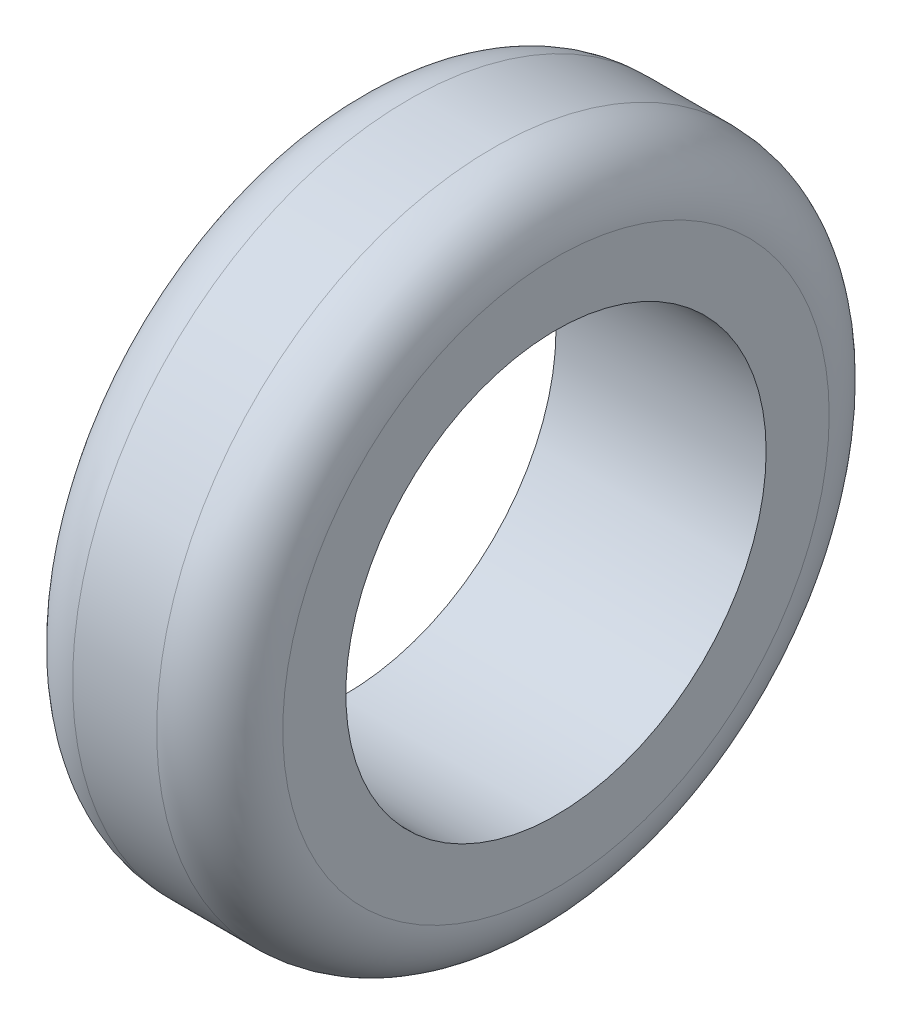
ISO-10303-21;
HEADER;
FILE_DESCRIPTION(('STEP AP214'),'2;1');
FILE_NAME('part.step','',(''),(''),'','','');
FILE_SCHEMA(('AUTOMOTIVE_DESIGN { 1 0 10303 214 1 1 1 1 }'));
ENDSEC;
DATA;
#1=APPLICATION_CONTEXT('core data for automotive mechanical design processes');
#2=APPLICATION_PROTOCOL_DEFINITION('international standard','automotive_design',2000,#1);
#3=PRODUCT_CONTEXT('',#1,'mechanical');
#4=PRODUCT('Part','Part','',(#3));
#5=PRODUCT_RELATED_PRODUCT_CATEGORY('part','',(#4));
#6=PRODUCT_DEFINITION_FORMATION('','',#4);
#7=PRODUCT_DEFINITION_CONTEXT('part definition',#1,'design');
#8=PRODUCT_DEFINITION('design','',#6,#7);
#9=PRODUCT_DEFINITION_SHAPE('','',#8);
#10=(LENGTH_UNIT() NAMED_UNIT(*) SI_UNIT(.MILLI.,.METRE.));
#11=(NAMED_UNIT(*) PLANE_ANGLE_UNIT() SI_UNIT($,.RADIAN.));
#12=(NAMED_UNIT(*) SI_UNIT($,.STERADIAN.) SOLID_ANGLE_UNIT());
#13=UNCERTAINTY_MEASURE_WITH_UNIT(LENGTH_MEASURE(1.E-05),#10,'distance_accuracy_value','');
#14=(GEOMETRIC_REPRESENTATION_CONTEXT(3) GLOBAL_UNCERTAINTY_ASSIGNED_CONTEXT((#13)) GLOBAL_UNIT_ASSIGNED_CONTEXT((#10,
#11,#12)) REPRESENTATION_CONTEXT('',''));
#15=CARTESIAN_POINT('',(0.,0.,0.));
#16=DIRECTION('',(0.,0.,1.));
#17=DIRECTION('',(1.,0.,0.));
#18=AXIS2_PLACEMENT_3D('',#15,#16,#17);
#19=CARTESIAN_POINT('',(276.274169979695,0.,0.));
#20=DIRECTION('',(-1.,0.,0.));
#21=DIRECTION('',(0.,0.,1.));
#22=AXIS2_PLACEMENT_3D('',#19,#20,#21);
#23=CYLINDRICAL_SURFACE('',#22,80.);
#24=CARTESIAN_POINT('',(35.,0.,0.));
#25=DIRECTION('',(1.,0.,0.));
#26=DIRECTION('',(0.,0.,-1.));
#27=AXIS2_PLACEMENT_3D('',#24,#25,#26);
#28=CIRCLE('',#27,80.);
#29=CARTESIAN_POINT('',(35.,0.,-80.));
#30=VERTEX_POINT('',#29);
#31=EDGE_CURVE('E64',#30,#30,#28,.F.);
#32=ORIENTED_EDGE('',*,*,#31,.T.);
#33=EDGE_LOOP('',(#32));
#34=FACE_BOUND('',#33,.T.);
#35=CARTESIAN_POINT('',(15.,0.,0.));
#36=DIRECTION('',(1.,0.,0.));
#37=DIRECTION('',(0.,0.,-1.));
#38=AXIS2_PLACEMENT_3D('',#35,#36,#37);
#39=CIRCLE('',#38,80.);
#40=CARTESIAN_POINT('',(15.,0.,-80.));
#41=VERTEX_POINT('',#40);
#42=EDGE_CURVE('E68',#41,#41,#39,.T.);
#43=ORIENTED_EDGE('',*,*,#42,.T.);
#44=EDGE_LOOP('',(#43));
#45=FACE_BOUND('',#44,.T.);
#46=ADVANCED_FACE('F32',(#34,#45),#23,.T.);
#47=CARTESIAN_POINT('',(0.,0.,0.));
#48=DIRECTION('',(1.,0.,0.));
#49=DIRECTION('',(0.,0.,-1.));
#50=AXIS2_PLACEMENT_3D('',#47,#48,#49);
#51=PLANE('',#50);
#52=CARTESIAN_POINT('',(0.,0.,0.));
#53=DIRECTION('',(1.,0.,0.));
#54=DIRECTION('',(0.,0.,-1.));
#55=AXIS2_PLACEMENT_3D('',#52,#53,#54);
#56=CIRCLE('',#55,65.);
#57=CARTESIAN_POINT('',(0.,0.,-65.));
#58=VERTEX_POINT('',#57);
#59=EDGE_CURVE('E49',#58,#58,#56,.F.);
#60=ORIENTED_EDGE('',*,*,#59,.T.);
#61=EDGE_LOOP('',(#60));
#62=FACE_BOUND('',#61,.T.);
#63=CARTESIAN_POINT('',(0.,0.,0.));
#64=DIRECTION('',(1.,0.,0.));
#65=DIRECTION('',(0.,0.,-1.));
#66=AXIS2_PLACEMENT_3D('',#63,#64,#65);
#67=CIRCLE('',#66,50.);
#68=CARTESIAN_POINT('',(0.,0.,-50.));
#69=VERTEX_POINT('',#68);
#70=EDGE_CURVE('E77',#69,#69,#67,.T.);
#71=ORIENTED_EDGE('',*,*,#70,.T.);
#72=EDGE_LOOP('',(#71));
#73=FACE_BOUND('',#72,.T.);
#74=ADVANCED_FACE('F84',(#62,#73),#51,.F.);
#75=CARTESIAN_POINT('',(276.274169979695,0.,0.));
#76=DIRECTION('',(-1.,0.,0.));
#77=DIRECTION('',(0.,0.,1.));
#78=AXIS2_PLACEMENT_3D('',#75,#76,#77);
#79=CYLINDRICAL_SURFACE('',#78,50.);
#80=ORIENTED_EDGE('',*,*,#70,.F.);
#81=EDGE_LOOP('',(#80));
#82=FACE_BOUND('',#81,.T.);
#83=CARTESIAN_POINT('',(50.,0.,0.));
#84=DIRECTION('',(1.,0.,0.));
#85=DIRECTION('',(0.,0.,-1.));
#86=AXIS2_PLACEMENT_3D('',#83,#84,#85);
#87=CIRCLE('',#86,50.);
#88=CARTESIAN_POINT('',(50.,0.,-50.));
#89=VERTEX_POINT('',#88);
#90=EDGE_CURVE('E78',#89,#89,#87,.T.);
#91=ORIENTED_EDGE('',*,*,#90,.T.);
#92=EDGE_LOOP('',(#91));
#93=FACE_BOUND('',#92,.T.);
#94=ADVANCED_FACE('F86',(#82,#93),#79,.F.);
#95=CARTESIAN_POINT('',(50.,0.,0.));
#96=DIRECTION('',(1.,0.,0.));
#97=DIRECTION('',(0.,0.092032875717063,-0.995755968994034));
#98=AXIS2_PLACEMENT_3D('',#95,#96,#97);
#99=PLANE('',#98);
#100=CARTESIAN_POINT('',(50.,0.,0.));
#101=DIRECTION('',(1.,0.,0.));
#102=DIRECTION('',(0.,0.,-1.));
#103=AXIS2_PLACEMENT_3D('',#100,#101,#102);
#104=CIRCLE('',#103,65.);
#105=CARTESIAN_POINT('',(50.,0.,-65.));
#106=VERTEX_POINT('',#105);
#107=EDGE_CURVE('E72',#106,#106,#104,.T.);
#108=ORIENTED_EDGE('',*,*,#107,.T.);
#109=EDGE_LOOP('',(#108));
#110=FACE_BOUND('',#109,.T.);
#111=ORIENTED_EDGE('',*,*,#90,.F.);
#112=EDGE_LOOP('',(#111));
#113=FACE_BOUND('',#112,.T.);
#114=ADVANCED_FACE('F89',(#110,#113),#99,.T.);
#115=CARTESIAN_POINT('',(35.,0.,0.));
#116=DIRECTION('',(1.,0.,0.));
#117=DIRECTION('',(0.,0.,-1.));
#118=AXIS2_PLACEMENT_3D('',#115,#116,#117);
#119=TOROIDAL_SURFACE('',#118,65.,15.);
#120=ORIENTED_EDGE('',*,*,#31,.F.);
#121=EDGE_LOOP('',(#120));
#122=FACE_BOUND('',#121,.T.);
#123=ORIENTED_EDGE('',*,*,#107,.F.);
#124=EDGE_LOOP('',(#123));
#125=FACE_BOUND('',#124,.T.);
#126=ADVANCED_FACE('F94',(#122,#125),#119,.T.);
#127=CARTESIAN_POINT('',(15.,0.,0.));
#128=DIRECTION('',(1.,0.,0.));
#129=DIRECTION('',(0.,0.,-1.));
#130=AXIS2_PLACEMENT_3D('',#127,#128,#129);
#131=TOROIDAL_SURFACE('',#130,65.,15.);
#132=ORIENTED_EDGE('',*,*,#59,.F.);
#133=EDGE_LOOP('',(#132));
#134=FACE_BOUND('',#133,.T.);
#135=ORIENTED_EDGE('',*,*,#42,.F.);
#136=EDGE_LOOP('',(#135));
#137=FACE_BOUND('',#136,.T.);
#138=ADVANCED_FACE('F100',(#134,#137),#131,.T.);
#139=CLOSED_SHELL('',(#46,#74,#94,#114,#126,#138));
#140=CARTESIAN_POINT('',(276.274169979695,0.,0.));
#141=DIRECTION('',(-1.,0.,0.));
#142=DIRECTION('',(0.,0.,1.));
#143=AXIS2_PLACEMENT_3D('',#140,#141,#142);
#144=CYLINDRICAL_SURFACE('',#143,77.);
#145=CARTESIAN_POINT('',(35.,0.,0.));
#146=DIRECTION('',(-1.,0.,0.));
#147=DIRECTION('',(0.,0.,1.));
#148=AXIS2_PLACEMENT_3D('',#145,#146,#147);
#149=CIRCLE('',#148,77.);
#150=CARTESIAN_POINT('',(35.,0.,77.));
#151=VERTEX_POINT('',#150);
#152=EDGE_CURVE('E36',#151,#151,#149,.T.);
#153=ORIENTED_EDGE('',*,*,#152,.F.);
#154=EDGE_LOOP('',(#153));
#155=FACE_BOUND('',#154,.T.);
#156=CARTESIAN_POINT('',(15.,0.,0.));
#157=DIRECTION('',(-1.,0.,0.));
#158=DIRECTION('',(0.,0.,1.));
#159=AXIS2_PLACEMENT_3D('',#156,#157,#158);
#160=CIRCLE('',#159,77.);
#161=CARTESIAN_POINT('',(15.,0.,77.));
#162=VERTEX_POINT('',#161);
#163=EDGE_CURVE('E56',#162,#162,#160,.F.);
#164=ORIENTED_EDGE('',*,*,#163,.F.);
#165=EDGE_LOOP('',(#164));
#166=FACE_BOUND('',#165,.T.);
#167=ADVANCED_FACE('F114',(#155,#166),#144,.F.);
#168=CARTESIAN_POINT('',(3.,0.,0.));
#169=DIRECTION('',(1.,0.,0.));
#170=DIRECTION('',(0.,0.,-1.));
#171=AXIS2_PLACEMENT_3D('',#168,#169,#170);
#172=PLANE('',#171);
#173=CARTESIAN_POINT('',(3.00000000000001,0.,0.));
#174=DIRECTION('',(1.,0.,0.));
#175=DIRECTION('',(0.,0.,-1.));
#176=AXIS2_PLACEMENT_3D('',#173,#174,#175);
#177=CIRCLE('',#176,65.);
#178=CARTESIAN_POINT('',(3.00000000000001,0.,-65.));
#179=VERTEX_POINT('',#178);
#180=EDGE_CURVE('E54',#179,#179,#177,.F.);
#181=ORIENTED_EDGE('',*,*,#180,.F.);
#182=EDGE_LOOP('',(#181));
#183=FACE_BOUND('',#182,.T.);
#184=CARTESIAN_POINT('',(3.,0.,0.));
#185=DIRECTION('',(1.,0.,0.));
#186=DIRECTION('',(0.,0.,-1.));
#187=AXIS2_PLACEMENT_3D('',#184,#185,#186);
#188=CIRCLE('',#187,53.);
#189=CARTESIAN_POINT('',(3.,0.,-53.));
#190=VERTEX_POINT('',#189);
#191=EDGE_CURVE('E46',#190,#190,#188,.T.);
#192=ORIENTED_EDGE('',*,*,#191,.F.);
#193=EDGE_LOOP('',(#192));
#194=FACE_BOUND('',#193,.T.);
#195=ADVANCED_FACE('F117',(#183,#194),#172,.T.);
#196=CARTESIAN_POINT('',(276.274169979695,0.,0.));
#197=DIRECTION('',(-1.,0.,0.));
#198=DIRECTION('',(0.,0.,1.));
#199=AXIS2_PLACEMENT_3D('',#196,#197,#198);
#200=CYLINDRICAL_SURFACE('',#199,53.);
#201=ORIENTED_EDGE('',*,*,#191,.T.);
#202=EDGE_LOOP('',(#201));
#203=FACE_BOUND('',#202,.T.);
#204=CARTESIAN_POINT('',(47.,0.,0.));
#205=DIRECTION('',(1.,0.,0.));
#206=DIRECTION('',(0.,0.,-1.));
#207=AXIS2_PLACEMENT_3D('',#204,#205,#206);
#208=CIRCLE('',#207,53.);
#209=CARTESIAN_POINT('',(47.,0.,-53.));
#210=VERTEX_POINT('',#209);
#211=EDGE_CURVE('E41',#210,#210,#208,.T.);
#212=ORIENTED_EDGE('',*,*,#211,.F.);
#213=EDGE_LOOP('',(#212));
#214=FACE_BOUND('',#213,.T.);
#215=ADVANCED_FACE('F122',(#203,#214),#200,.T.);
#216=CARTESIAN_POINT('',(47.,0.,0.));
#217=DIRECTION('',(1.,0.,0.));
#218=DIRECTION('',(0.,0.092032875717063,-0.995755968994034));
#219=AXIS2_PLACEMENT_3D('',#216,#217,#218);
#220=PLANE('',#219);
#221=CARTESIAN_POINT('',(47.,0.,0.));
#222=DIRECTION('',(1.,0.,0.));
#223=DIRECTION('',(0.,0.,-1.));
#224=AXIS2_PLACEMENT_3D('',#221,#222,#223);
#225=CIRCLE('',#224,65.);
#226=CARTESIAN_POINT('',(47.,0.,-65.));
#227=VERTEX_POINT('',#226);
#228=EDGE_CURVE('E10',#227,#227,#225,.T.);
#229=ORIENTED_EDGE('',*,*,#228,.F.);
#230=EDGE_LOOP('',(#229));
#231=FACE_BOUND('',#230,.T.);
#232=ORIENTED_EDGE('',*,*,#211,.T.);
#233=EDGE_LOOP('',(#232));
#234=FACE_BOUND('',#233,.T.);
#235=ADVANCED_FACE('F126',(#231,#234),#220,.F.);
#236=CARTESIAN_POINT('',(35.,0.,0.));
#237=DIRECTION('',(1.,0.,0.));
#238=DIRECTION('',(0.,0.,-1.));
#239=AXIS2_PLACEMENT_3D('',#236,#237,#238);
#240=TOROIDAL_SURFACE('',#239,65.,12.);
#241=ORIENTED_EDGE('',*,*,#152,.T.);
#242=EDGE_LOOP('',(#241));
#243=FACE_BOUND('',#242,.T.);
#244=ORIENTED_EDGE('',*,*,#228,.T.);
#245=EDGE_LOOP('',(#244));
#246=FACE_BOUND('',#245,.T.);
#247=ADVANCED_FACE('F129',(#243,#246),#240,.F.);
#248=CARTESIAN_POINT('',(15.,0.,0.));
#249=DIRECTION('',(1.,0.,0.));
#250=DIRECTION('',(0.,0.,-1.));
#251=AXIS2_PLACEMENT_3D('',#248,#249,#250);
#252=TOROIDAL_SURFACE('',#251,65.,12.);
#253=ORIENTED_EDGE('',*,*,#180,.T.);
#254=EDGE_LOOP('',(#253));
#255=FACE_BOUND('',#254,.T.);
#256=ORIENTED_EDGE('',*,*,#163,.T.);
#257=EDGE_LOOP('',(#256));
#258=FACE_BOUND('',#257,.T.);
#259=ADVANCED_FACE('F34',(#255,#258),#252,.F.);
#260=CLOSED_SHELL('',(#167,#195,#215,#235,#247,#259));
#261=ORIENTED_CLOSED_SHELL('',*,#260,.T.);
#262=BREP_WITH_VOIDS('B2',#139,(#261));
#263=ADVANCED_BREP_SHAPE_REPRESENTATION('',(#18,#262),#14);
#264=SHAPE_DEFINITION_REPRESENTATION(#9,#263);
ENDSEC;
END-ISO-10303-21;
